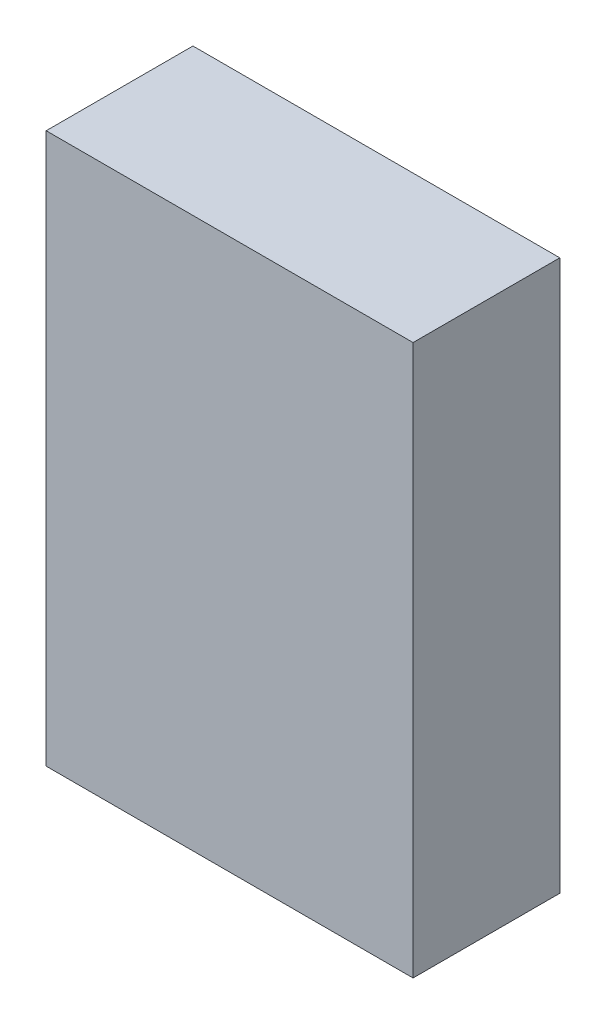
ISO-10303-21;
HEADER;
FILE_DESCRIPTION(('STEP AP214'),'2;1');
FILE_NAME('part.step','',(''),(''),'','','');
FILE_SCHEMA(('AUTOMOTIVE_DESIGN { 1 0 10303 214 1 1 1 1 }'));
ENDSEC;
DATA;
#1=APPLICATION_CONTEXT('core data for automotive mechanical design processes');
#2=APPLICATION_PROTOCOL_DEFINITION('international standard','automotive_design',2000,#1);
#3=PRODUCT_CONTEXT('',#1,'mechanical');
#4=PRODUCT('Part','Part','',(#3));
#5=PRODUCT_RELATED_PRODUCT_CATEGORY('part','',(#4));
#6=PRODUCT_DEFINITION_FORMATION('','',#4);
#7=PRODUCT_DEFINITION_CONTEXT('part definition',#1,'design');
#8=PRODUCT_DEFINITION('design','',#6,#7);
#9=PRODUCT_DEFINITION_SHAPE('','',#8);
#10=(LENGTH_UNIT() NAMED_UNIT(*) SI_UNIT(.MILLI.,.METRE.));
#11=(NAMED_UNIT(*) PLANE_ANGLE_UNIT() SI_UNIT($,.RADIAN.));
#12=(NAMED_UNIT(*) SI_UNIT($,.STERADIAN.) SOLID_ANGLE_UNIT());
#13=UNCERTAINTY_MEASURE_WITH_UNIT(LENGTH_MEASURE(1.E-05),#10,'distance_accuracy_value','');
#14=(GEOMETRIC_REPRESENTATION_CONTEXT(3) GLOBAL_UNCERTAINTY_ASSIGNED_CONTEXT((#13)) GLOBAL_UNIT_ASSIGNED_CONTEXT((#10,
#11,#12)) REPRESENTATION_CONTEXT('',''));
#15=CARTESIAN_POINT('',(0.,0.,0.));
#16=DIRECTION('',(0.,0.,1.));
#17=DIRECTION('',(1.,0.,0.));
#18=AXIS2_PLACEMENT_3D('',#15,#16,#17);
#19=CARTESIAN_POINT('',(0.,0.,10.16));
#20=DIRECTION('',(0.,1.,0.));
#21=DIRECTION('',(0.,0.,1.));
#22=AXIS2_PLACEMENT_3D('',#19,#20,#21);
#23=PLANE('',#22);
#24=DIRECTION('',(1.,0.,0.));
#25=VECTOR('',#24,1.);
#26=CARTESIAN_POINT('',(0.,0.,0.));
#27=LINE('',#26,#25);
#28=CARTESIAN_POINT('',(0.,0.,0.));
#29=VERTEX_POINT('',#28);
#30=CARTESIAN_POINT('',(25.4,0.,0.));
#31=VERTEX_POINT('',#30);
#32=EDGE_CURVE('E96',#29,#31,#27,.T.);
#33=ORIENTED_EDGE('',*,*,#32,.T.);
#34=DIRECTION('',(0.,0.,-1.));
#35=VECTOR('',#34,1.);
#36=CARTESIAN_POINT('',(25.4,0.,10.16));
#37=LINE('',#36,#35);
#38=CARTESIAN_POINT('',(25.4,0.,10.16));
#39=VERTEX_POINT('',#38);
#40=EDGE_CURVE('E11',#39,#31,#37,.T.);
#41=ORIENTED_EDGE('',*,*,#40,.F.);
#42=DIRECTION('',(1.,0.,0.));
#43=VECTOR('',#42,1.);
#44=CARTESIAN_POINT('',(0.,0.,10.16));
#45=LINE('',#44,#43);
#46=CARTESIAN_POINT('',(0.,0.,10.16));
#47=VERTEX_POINT('',#46);
#48=EDGE_CURVE('E82',#47,#39,#45,.T.);
#49=ORIENTED_EDGE('',*,*,#48,.F.);
#50=DIRECTION('',(0.,0.,-1.));
#51=VECTOR('',#50,1.);
#52=CARTESIAN_POINT('',(0.,0.,10.16));
#53=LINE('',#52,#51);
#54=EDGE_CURVE('E49',#47,#29,#53,.T.);
#55=ORIENTED_EDGE('',*,*,#54,.T.);
#56=EDGE_LOOP('',(#33,#41,#49,#55));
#57=FACE_BOUND('',#56,.T.);
#58=ADVANCED_FACE('F33',(#57),#23,.F.);
#59=CARTESIAN_POINT('',(25.4,0.,10.16));
#60=DIRECTION('',(-1.,0.,0.));
#61=DIRECTION('',(0.,0.,1.));
#62=AXIS2_PLACEMENT_3D('',#59,#60,#61);
#63=PLANE('',#62);
#64=DIRECTION('',(0.,1.,0.));
#65=VECTOR('',#64,1.);
#66=CARTESIAN_POINT('',(25.4,0.,0.));
#67=LINE('',#66,#65);
#68=CARTESIAN_POINT('',(25.4,38.1,0.));
#69=VERTEX_POINT('',#68);
#70=EDGE_CURVE('E87',#31,#69,#67,.T.);
#71=ORIENTED_EDGE('',*,*,#70,.T.);
#72=DIRECTION('',(0.,0.,-1.));
#73=VECTOR('',#72,1.);
#74=CARTESIAN_POINT('',(25.4,38.1,10.16));
#75=LINE('',#74,#73);
#76=CARTESIAN_POINT('',(25.4,38.1,10.16));
#77=VERTEX_POINT('',#76);
#78=EDGE_CURVE('E41',#77,#69,#75,.T.);
#79=ORIENTED_EDGE('',*,*,#78,.F.);
#80=DIRECTION('',(0.,1.,0.));
#81=VECTOR('',#80,1.);
#82=CARTESIAN_POINT('',(25.4,0.,10.16));
#83=LINE('',#82,#81);
#84=EDGE_CURVE('E74',#39,#77,#83,.T.);
#85=ORIENTED_EDGE('',*,*,#84,.F.);
#86=ORIENTED_EDGE('',*,*,#40,.T.);
#87=EDGE_LOOP('',(#71,#79,#85,#86));
#88=FACE_BOUND('',#87,.T.);
#89=ADVANCED_FACE('F86',(#88),#63,.F.);
#90=CARTESIAN_POINT('',(0.,38.1,10.16));
#91=DIRECTION('',(0.,1.,0.));
#92=DIRECTION('',(0.,0.,1.));
#93=AXIS2_PLACEMENT_3D('',#90,#91,#92);
#94=PLANE('',#93);
#95=DIRECTION('',(1.,0.,0.));
#96=VECTOR('',#95,1.);
#97=CARTESIAN_POINT('',(0.,38.1,0.));
#98=LINE('',#97,#96);
#99=CARTESIAN_POINT('',(0.,38.1,0.));
#100=VERTEX_POINT('',#99);
#101=EDGE_CURVE('E100',#100,#69,#98,.T.);
#102=ORIENTED_EDGE('',*,*,#101,.F.);
#103=DIRECTION('',(0.,0.,-1.));
#104=VECTOR('',#103,1.);
#105=CARTESIAN_POINT('',(0.,38.1,10.16));
#106=LINE('',#105,#104);
#107=CARTESIAN_POINT('',(0.,38.1,10.16));
#108=VERTEX_POINT('',#107);
#109=EDGE_CURVE('E63',#108,#100,#106,.T.);
#110=ORIENTED_EDGE('',*,*,#109,.F.);
#111=DIRECTION('',(1.,0.,0.));
#112=VECTOR('',#111,1.);
#113=CARTESIAN_POINT('',(0.,38.1,10.16));
#114=LINE('',#113,#112);
#115=EDGE_CURVE('E81',#108,#77,#114,.T.);
#116=ORIENTED_EDGE('',*,*,#115,.T.);
#117=ORIENTED_EDGE('',*,*,#78,.T.);
#118=EDGE_LOOP('',(#102,#110,#116,#117));
#119=FACE_BOUND('',#118,.T.);
#120=ADVANCED_FACE('F90',(#119),#94,.T.);
#121=CARTESIAN_POINT('',(0.,0.,10.16));
#122=DIRECTION('',(-1.,0.,0.));
#123=DIRECTION('',(0.,0.,1.));
#124=AXIS2_PLACEMENT_3D('',#121,#122,#123);
#125=PLANE('',#124);
#126=CARTESIAN_POINT('',(0.,30.48,5.13070977270862));
#127=DIRECTION('',(-1.,0.,0.));
#128=DIRECTION('',(0.,0.,1.));
#129=AXIS2_PLACEMENT_3D('',#126,#127,#128);
#130=CIRCLE('',#129,1.905);
#131=CARTESIAN_POINT('',(0.,30.48,7.03570977270862));
#132=VERTEX_POINT('',#131);
#133=EDGE_CURVE('E114',#132,#132,#130,.T.);
#134=ORIENTED_EDGE('',*,*,#133,.F.);
#135=EDGE_LOOP('',(#134));
#136=FACE_BOUND('',#135,.T.);
#137=CARTESIAN_POINT('',(0.,7.62,5.13070977270862));
#138=DIRECTION('',(-1.,0.,0.));
#139=DIRECTION('',(0.,0.,1.));
#140=AXIS2_PLACEMENT_3D('',#137,#138,#139);
#141=CIRCLE('',#140,1.905);
#142=CARTESIAN_POINT('',(0.,7.62,7.03570977270862));
#143=VERTEX_POINT('',#142);
#144=EDGE_CURVE('E108',#143,#143,#141,.T.);
#145=ORIENTED_EDGE('',*,*,#144,.F.);
#146=EDGE_LOOP('',(#145));
#147=FACE_BOUND('',#146,.T.);
#148=DIRECTION('',(0.,1.,0.));
#149=VECTOR('',#148,1.);
#150=CARTESIAN_POINT('',(0.,0.,0.));
#151=LINE('',#150,#149);
#152=EDGE_CURVE('E102',#29,#100,#151,.T.);
#153=ORIENTED_EDGE('',*,*,#152,.F.);
#154=ORIENTED_EDGE('',*,*,#54,.F.);
#155=DIRECTION('',(0.,1.,0.));
#156=VECTOR('',#155,1.);
#157=CARTESIAN_POINT('',(0.,0.,10.16));
#158=LINE('',#157,#156);
#159=EDGE_CURVE('E91',#47,#108,#158,.T.);
#160=ORIENTED_EDGE('',*,*,#159,.T.);
#161=ORIENTED_EDGE('',*,*,#109,.T.);
#162=EDGE_LOOP('',(#153,#154,#160,#161));
#163=FACE_BOUND('',#162,.T.);
#164=ADVANCED_FACE('F129',(#136,#147,#163),#125,.T.);
#165=CARTESIAN_POINT('',(0.,0.,10.16));
#166=DIRECTION('',(0.,0.,1.));
#167=DIRECTION('',(1.,0.,0.));
#168=AXIS2_PLACEMENT_3D('',#165,#166,#167);
#169=PLANE('',#168);
#170=ORIENTED_EDGE('',*,*,#48,.T.);
#171=ORIENTED_EDGE('',*,*,#84,.T.);
#172=ORIENTED_EDGE('',*,*,#115,.F.);
#173=ORIENTED_EDGE('',*,*,#159,.F.);
#174=EDGE_LOOP('',(#170,#171,#172,#173));
#175=FACE_BOUND('',#174,.T.);
#176=ADVANCED_FACE('F78',(#175),#169,.T.);
#177=CARTESIAN_POINT('',(0.,0.,0.));
#178=DIRECTION('',(0.,0.,1.));
#179=DIRECTION('',(1.,0.,0.));
#180=AXIS2_PLACEMENT_3D('',#177,#178,#179);
#181=PLANE('',#180);
#182=ORIENTED_EDGE('',*,*,#32,.F.);
#183=ORIENTED_EDGE('',*,*,#152,.T.);
#184=ORIENTED_EDGE('',*,*,#101,.T.);
#185=ORIENTED_EDGE('',*,*,#70,.F.);
#186=EDGE_LOOP('',(#182,#183,#184,#185));
#187=FACE_BOUND('',#186,.T.);
#188=ADVANCED_FACE('F137',(#187),#181,.F.);
#189=CARTESIAN_POINT('',(10.16,7.62,5.13070977270862));
#190=DIRECTION('',(-1.,0.,0.));
#191=DIRECTION('',(0.,0.,1.));
#192=AXIS2_PLACEMENT_3D('',#189,#190,#191);
#193=CYLINDRICAL_SURFACE('',#192,1.905);
#194=CARTESIAN_POINT('',(10.16,7.62,5.13070977270862));
#195=DIRECTION('',(-1.,0.,0.));
#196=DIRECTION('',(0.,0.,1.));
#197=AXIS2_PLACEMENT_3D('',#194,#195,#196);
#198=CIRCLE('',#197,1.905);
#199=CARTESIAN_POINT('',(10.16,7.62,7.03570977270862));
#200=VERTEX_POINT('',#199);
#201=EDGE_CURVE('E111',#200,#200,#198,.T.);
#202=ORIENTED_EDGE('',*,*,#201,.F.);
#203=EDGE_LOOP('',(#202));
#204=FACE_BOUND('',#203,.T.);
#205=ORIENTED_EDGE('',*,*,#144,.T.);
#206=EDGE_LOOP('',(#205));
#207=FACE_BOUND('',#206,.T.);
#208=ADVANCED_FACE('F135',(#204,#207),#193,.F.);
#209=CARTESIAN_POINT('',(10.16,7.62,5.13070977270862));
#210=DIRECTION('',(-1.,0.,0.));
#211=DIRECTION('',(0.,0.,1.));
#212=AXIS2_PLACEMENT_3D('',#209,#210,#211);
#213=PLANE('',#212);
#214=ORIENTED_EDGE('',*,*,#201,.T.);
#215=EDGE_LOOP('',(#214));
#216=FACE_BOUND('',#215,.T.);
#217=ADVANCED_FACE('F125',(#216),#213,.T.);
#218=CARTESIAN_POINT('',(10.16,30.48,5.13070977270862));
#219=DIRECTION('',(-1.,0.,0.));
#220=DIRECTION('',(0.,0.,1.));
#221=AXIS2_PLACEMENT_3D('',#218,#219,#220);
#222=CYLINDRICAL_SURFACE('',#221,1.905);
#223=CARTESIAN_POINT('',(10.16,30.48,5.13070977270862));
#224=DIRECTION('',(-1.,0.,0.));
#225=DIRECTION('',(0.,0.,1.));
#226=AXIS2_PLACEMENT_3D('',#223,#224,#225);
#227=CIRCLE('',#226,1.905);
#228=CARTESIAN_POINT('',(10.16,30.48,7.03570977270862));
#229=VERTEX_POINT('',#228);
#230=EDGE_CURVE('E98',#229,#229,#227,.T.);
#231=ORIENTED_EDGE('',*,*,#230,.F.);
#232=EDGE_LOOP('',(#231));
#233=FACE_BOUND('',#232,.T.);
#234=ORIENTED_EDGE('',*,*,#133,.T.);
#235=EDGE_LOOP('',(#234));
#236=FACE_BOUND('',#235,.T.);
#237=ADVANCED_FACE('F122',(#233,#236),#222,.F.);
#238=CARTESIAN_POINT('',(10.16,30.48,5.13070977270862));
#239=DIRECTION('',(-1.,0.,0.));
#240=DIRECTION('',(0.,0.,1.));
#241=AXIS2_PLACEMENT_3D('',#238,#239,#240);
#242=PLANE('',#241);
#243=ORIENTED_EDGE('',*,*,#230,.T.);
#244=EDGE_LOOP('',(#243));
#245=FACE_BOUND('',#244,.T.);
#246=ADVANCED_FACE('F120',(#245),#242,.T.);
#247=CLOSED_SHELL('',(#58,#89,#120,#164,#176,#188,#208,#217,#237,#246));
#248=MANIFOLD_SOLID_BREP('B2',#247);
#249=ADVANCED_BREP_SHAPE_REPRESENTATION('',(#18,#248),#14);
#250=SHAPE_DEFINITION_REPRESENTATION(#9,#249);
ENDSEC;
END-ISO-10303-21;
